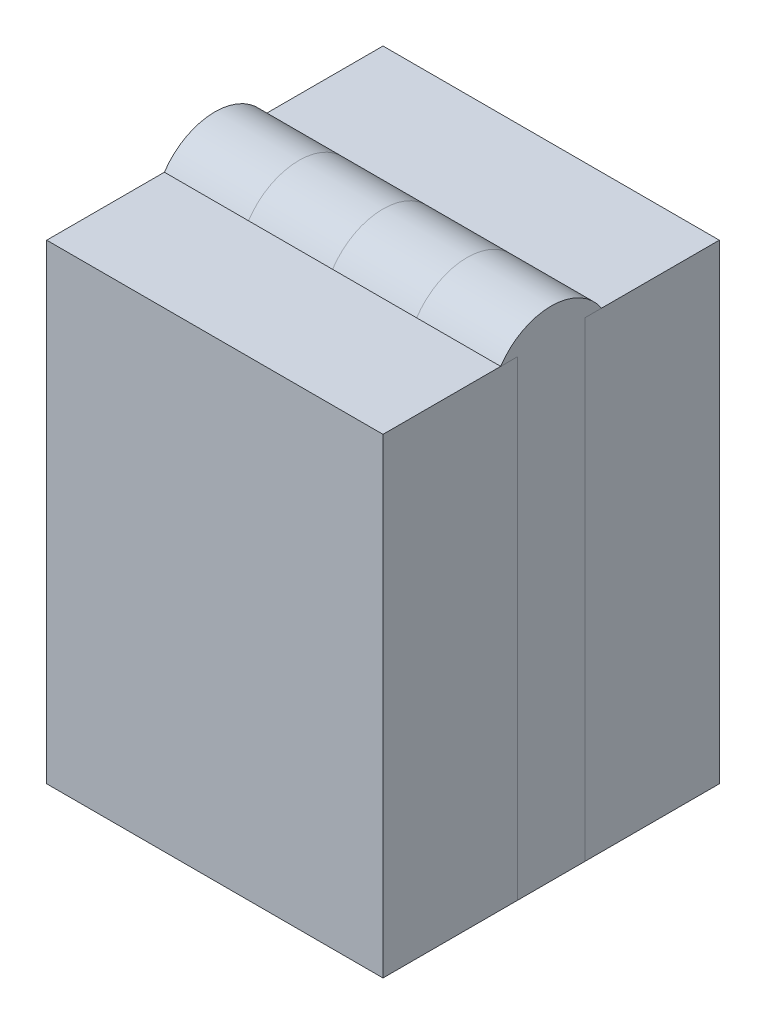
ISO-10303-21;
HEADER;
FILE_DESCRIPTION(('STEP AP214'),'2;1');
FILE_NAME('part.step','',(''),(''),'','','');
FILE_SCHEMA(('AUTOMOTIVE_DESIGN { 1 0 10303 214 1 1 1 1 }'));
ENDSEC;
DATA;
#1=APPLICATION_CONTEXT('core data for automotive mechanical design processes');
#2=APPLICATION_PROTOCOL_DEFINITION('international standard','automotive_design',2000,#1);
#3=PRODUCT_CONTEXT('',#1,'mechanical');
#4=PRODUCT('Part','Part','',(#3));
#5=PRODUCT_RELATED_PRODUCT_CATEGORY('part','',(#4));
#6=PRODUCT_DEFINITION_FORMATION('','',#4);
#7=PRODUCT_DEFINITION_CONTEXT('part definition',#1,'design');
#8=PRODUCT_DEFINITION('design','',#6,#7);
#9=PRODUCT_DEFINITION_SHAPE('','',#8);
#10=(LENGTH_UNIT() NAMED_UNIT(*) SI_UNIT(.MILLI.,.METRE.));
#11=(NAMED_UNIT(*) PLANE_ANGLE_UNIT() SI_UNIT($,.RADIAN.));
#12=(NAMED_UNIT(*) SI_UNIT($,.STERADIAN.) SOLID_ANGLE_UNIT());
#13=UNCERTAINTY_MEASURE_WITH_UNIT(LENGTH_MEASURE(1.E-05),#10,'distance_accuracy_value','');
#14=(GEOMETRIC_REPRESENTATION_CONTEXT(3) GLOBAL_UNCERTAINTY_ASSIGNED_CONTEXT((#13)) GLOBAL_UNIT_ASSIGNED_CONTEXT((#10,
#11,#12)) REPRESENTATION_CONTEXT('',''));
#15=CARTESIAN_POINT('',(0.,0.,0.));
#16=DIRECTION('',(0.,0.,1.));
#17=DIRECTION('',(1.,0.,0.));
#18=AXIS2_PLACEMENT_3D('',#15,#16,#17);
#19=CARTESIAN_POINT('',(5.,3.00190738505071,0.));
#20=DIRECTION('',(-1.,0.,0.));
#21=DIRECTION('',(0.,0.,1.));
#22=AXIS2_PLACEMENT_3D('',#19,#20,#21);
#23=CYLINDRICAL_SURFACE('',#22,0.900331190766501);
#24=CARTESIAN_POINT('',(3.75,3.00190738505071,0.));
#25=DIRECTION('',(1.,0.,0.));
#26=DIRECTION('',(0.,0.,-1.));
#27=AXIS2_PLACEMENT_3D('',#24,#25,#26);
#28=CIRCLE('',#27,0.900331190766501);
#29=CARTESIAN_POINT('',(3.75,3.5,-0.75));
#30=VERTEX_POINT('',#29);
#31=CARTESIAN_POINT('',(3.75,3.5,0.750000000000001));
#32=VERTEX_POINT('',#31);
#33=EDGE_CURVE('E130',#30,#32,#28,.T.);
#34=ORIENTED_EDGE('',*,*,#33,.T.);
#35=DIRECTION('',(-1.,0.,0.));
#36=VECTOR('',#35,1.);
#37=CARTESIAN_POINT('',(5.,3.5,0.750000000000001));
#38=LINE('',#37,#36);
#39=CARTESIAN_POINT('',(5.,3.5,0.750000000000001));
#40=VERTEX_POINT('',#39);
#41=EDGE_CURVE('E12',#40,#32,#38,.T.);
#42=ORIENTED_EDGE('',*,*,#41,.F.);
#43=CARTESIAN_POINT('',(5.,3.00190738505071,0.));
#44=DIRECTION('',(1.,0.,0.));
#45=DIRECTION('',(0.,0.,-1.));
#46=AXIS2_PLACEMENT_3D('',#43,#44,#45);
#47=CIRCLE('',#46,0.900331190766501);
#48=CARTESIAN_POINT('',(5.,3.5,-0.75));
#49=VERTEX_POINT('',#48);
#50=EDGE_CURVE('E140',#49,#40,#47,.T.);
#51=ORIENTED_EDGE('',*,*,#50,.F.);
#52=DIRECTION('',(-1.,0.,0.));
#53=VECTOR('',#52,1.);
#54=CARTESIAN_POINT('',(5.,3.5,-0.75));
#55=LINE('',#54,#53);
#56=EDGE_CURVE('E126',#49,#30,#55,.T.);
#57=ORIENTED_EDGE('',*,*,#56,.T.);
#58=EDGE_LOOP('',(#34,#42,#51,#57));
#59=FACE_BOUND('',#58,.T.);
#60=ADVANCED_FACE('F46',(#59),#23,.T.);
#61=CARTESIAN_POINT('',(5.,3.5,0.750000000000001));
#62=DIRECTION('',(0.,1.,0.));
#63=DIRECTION('',(0.,0.,1.));
#64=AXIS2_PLACEMENT_3D('',#61,#62,#63);
#65=PLANE('',#64);
#66=DIRECTION('',(0.,0.,-1.));
#67=VECTOR('',#66,1.);
#68=CARTESIAN_POINT('',(3.75,3.5,0.750000000000001));
#69=LINE('',#68,#67);
#70=CARTESIAN_POINT('',(3.75,3.5,0.499999999999987));
#71=VERTEX_POINT('',#70);
#72=EDGE_CURVE('E133',#32,#71,#69,.T.);
#73=ORIENTED_EDGE('',*,*,#72,.T.);
#74=DIRECTION('',(-1.,0.,0.));
#75=VECTOR('',#74,1.);
#76=CARTESIAN_POINT('',(5.,3.5,0.499999999999987));
#77=LINE('',#76,#75);
#78=CARTESIAN_POINT('',(5.,3.5,0.499999999999987));
#79=VERTEX_POINT('',#78);
#80=EDGE_CURVE('E54',#79,#71,#77,.T.);
#81=ORIENTED_EDGE('',*,*,#80,.F.);
#82=DIRECTION('',(0.,0.,-1.));
#83=VECTOR('',#82,1.);
#84=CARTESIAN_POINT('',(5.,3.5,0.750000000000001));
#85=LINE('',#84,#83);
#86=EDGE_CURVE('E99',#40,#79,#85,.T.);
#87=ORIENTED_EDGE('',*,*,#86,.F.);
#88=ORIENTED_EDGE('',*,*,#41,.T.);
#89=EDGE_LOOP('',(#73,#81,#87,#88));
#90=FACE_BOUND('',#89,.T.);
#91=ADVANCED_FACE('F164',(#90),#65,.F.);
#92=CARTESIAN_POINT('',(5.,3.5,0.499999999999987));
#93=DIRECTION('',(0.,0.,-1.));
#94=DIRECTION('',(-1.,0.,0.));
#95=AXIS2_PLACEMENT_3D('',#92,#93,#94);
#96=PLANE('',#95);
#97=DIRECTION('',(0.,-1.,0.));
#98=VECTOR('',#97,1.);
#99=CARTESIAN_POINT('',(3.75,3.5,0.499999999999987));
#100=LINE('',#99,#98);
#101=CARTESIAN_POINT('',(3.75,-3.5,0.499999999999987));
#102=VERTEX_POINT('',#101);
#103=EDGE_CURVE('E135',#71,#102,#100,.T.);
#104=ORIENTED_EDGE('',*,*,#103,.T.);
#105=DIRECTION('',(-1.,0.,0.));
#106=VECTOR('',#105,1.);
#107=CARTESIAN_POINT('',(5.,-3.5,0.499999999999987));
#108=LINE('',#107,#106);
#109=CARTESIAN_POINT('',(5.,-3.5,0.499999999999987));
#110=VERTEX_POINT('',#109);
#111=EDGE_CURVE('E121',#110,#102,#108,.T.);
#112=ORIENTED_EDGE('',*,*,#111,.F.);
#113=DIRECTION('',(0.,-1.,0.));
#114=VECTOR('',#113,1.);
#115=CARTESIAN_POINT('',(5.,3.5,0.499999999999987));
#116=LINE('',#115,#114);
#117=EDGE_CURVE('E112',#79,#110,#116,.T.);
#118=ORIENTED_EDGE('',*,*,#117,.F.);
#119=ORIENTED_EDGE('',*,*,#80,.T.);
#120=EDGE_LOOP('',(#104,#112,#118,#119));
#121=FACE_BOUND('',#120,.T.);
#122=ADVANCED_FACE('F146',(#121),#96,.F.);
#123=CARTESIAN_POINT('',(5.,-3.5,0.499999999999987));
#124=DIRECTION('',(0.,1.,0.));
#125=DIRECTION('',(0.,0.,1.));
#126=AXIS2_PLACEMENT_3D('',#123,#124,#125);
#127=PLANE('',#126);
#128=DIRECTION('',(0.,0.,-1.));
#129=VECTOR('',#128,1.);
#130=CARTESIAN_POINT('',(3.75,-3.5,0.499999999999987));
#131=LINE('',#130,#129);
#132=CARTESIAN_POINT('',(3.75,-3.5,-0.500000000000014));
#133=VERTEX_POINT('',#132);
#134=EDGE_CURVE('E120',#102,#133,#131,.T.);
#135=ORIENTED_EDGE('',*,*,#134,.T.);
#136=DIRECTION('',(-1.,0.,0.));
#137=VECTOR('',#136,1.);
#138=CARTESIAN_POINT('',(5.,-3.5,-0.500000000000014));
#139=LINE('',#138,#137);
#140=CARTESIAN_POINT('',(5.,-3.5,-0.500000000000014));
#141=VERTEX_POINT('',#140);
#142=EDGE_CURVE('E117',#141,#133,#139,.T.);
#143=ORIENTED_EDGE('',*,*,#142,.F.);
#144=DIRECTION('',(0.,0.,-1.));
#145=VECTOR('',#144,1.);
#146=CARTESIAN_POINT('',(5.,-3.5,0.499999999999987));
#147=LINE('',#146,#145);
#148=EDGE_CURVE('E106',#110,#141,#147,.T.);
#149=ORIENTED_EDGE('',*,*,#148,.F.);
#150=ORIENTED_EDGE('',*,*,#111,.T.);
#151=EDGE_LOOP('',(#135,#143,#149,#150));
#152=FACE_BOUND('',#151,.T.);
#153=ADVANCED_FACE('F118',(#152),#127,.F.);
#154=CARTESIAN_POINT('',(5.,-3.5,-0.500000000000014));
#155=DIRECTION('',(0.,0.,1.));
#156=DIRECTION('',(0.,-1.,0.));
#157=AXIS2_PLACEMENT_3D('',#154,#155,#156);
#158=PLANE('',#157);
#159=DIRECTION('',(0.,1.,0.));
#160=VECTOR('',#159,1.);
#161=CARTESIAN_POINT('',(3.75,-3.5,-0.500000000000014));
#162=LINE('',#161,#160);
#163=CARTESIAN_POINT('',(3.75,3.5,-0.500000000000013));
#164=VERTEX_POINT('',#163);
#165=EDGE_CURVE('E85',#133,#164,#162,.T.);
#166=ORIENTED_EDGE('',*,*,#165,.T.);
#167=DIRECTION('',(-1.,0.,0.));
#168=VECTOR('',#167,1.);
#169=CARTESIAN_POINT('',(5.,3.5,-0.500000000000013));
#170=LINE('',#169,#168);
#171=CARTESIAN_POINT('',(5.,3.5,-0.500000000000013));
#172=VERTEX_POINT('',#171);
#173=EDGE_CURVE('E122',#172,#164,#170,.T.);
#174=ORIENTED_EDGE('',*,*,#173,.F.);
#175=DIRECTION('',(0.,1.,0.));
#176=VECTOR('',#175,1.);
#177=CARTESIAN_POINT('',(5.,-3.5,-0.500000000000014));
#178=LINE('',#177,#176);
#179=EDGE_CURVE('E110',#141,#172,#178,.T.);
#180=ORIENTED_EDGE('',*,*,#179,.F.);
#181=ORIENTED_EDGE('',*,*,#142,.T.);
#182=EDGE_LOOP('',(#166,#174,#180,#181));
#183=FACE_BOUND('',#182,.T.);
#184=ADVANCED_FACE('F124',(#183),#158,.F.);
#185=CARTESIAN_POINT('',(5.,3.5,-0.500000000000013));
#186=DIRECTION('',(0.,1.,0.));
#187=DIRECTION('',(0.,0.,1.));
#188=AXIS2_PLACEMENT_3D('',#185,#186,#187);
#189=PLANE('',#188);
#190=DIRECTION('',(0.,0.,-1.));
#191=VECTOR('',#190,1.);
#192=CARTESIAN_POINT('',(3.75,3.5,-0.500000000000013));
#193=LINE('',#192,#191);
#194=EDGE_CURVE('E91',#164,#30,#193,.T.);
#195=ORIENTED_EDGE('',*,*,#194,.T.);
#196=ORIENTED_EDGE('',*,*,#56,.F.);
#197=DIRECTION('',(0.,0.,-1.));
#198=VECTOR('',#197,1.);
#199=CARTESIAN_POINT('',(5.,3.5,-0.500000000000013));
#200=LINE('',#199,#198);
#201=EDGE_CURVE('E62',#172,#49,#200,.T.);
#202=ORIENTED_EDGE('',*,*,#201,.F.);
#203=ORIENTED_EDGE('',*,*,#173,.T.);
#204=EDGE_LOOP('',(#195,#196,#202,#203));
#205=FACE_BOUND('',#204,.T.);
#206=ADVANCED_FACE('F153',(#205),#189,.F.);
#207=CARTESIAN_POINT('',(5.,3.00190738505071,0.));
#208=DIRECTION('',(1.,0.,0.));
#209=DIRECTION('',(0.,0.,-1.));
#210=AXIS2_PLACEMENT_3D('',#207,#208,#209);
#211=PLANE('',#210);
#212=ORIENTED_EDGE('',*,*,#50,.T.);
#213=ORIENTED_EDGE('',*,*,#86,.T.);
#214=ORIENTED_EDGE('',*,*,#117,.T.);
#215=ORIENTED_EDGE('',*,*,#148,.T.);
#216=ORIENTED_EDGE('',*,*,#179,.T.);
#217=ORIENTED_EDGE('',*,*,#201,.T.);
#218=EDGE_LOOP('',(#212,#213,#214,#215,#216,#217));
#219=FACE_BOUND('',#218,.T.);
#220=ADVANCED_FACE('F108',(#219),#211,.T.);
#221=CARTESIAN_POINT('',(3.75,3.00190738505071,0.));
#222=DIRECTION('',(1.,0.,0.));
#223=DIRECTION('',(0.,0.,-1.));
#224=AXIS2_PLACEMENT_3D('',#221,#222,#223);
#225=PLANE('',#224);
#226=ORIENTED_EDGE('',*,*,#33,.F.);
#227=ORIENTED_EDGE('',*,*,#194,.F.);
#228=ORIENTED_EDGE('',*,*,#165,.F.);
#229=ORIENTED_EDGE('',*,*,#134,.F.);
#230=ORIENTED_EDGE('',*,*,#103,.F.);
#231=ORIENTED_EDGE('',*,*,#72,.F.);
#232=EDGE_LOOP('',(#226,#227,#228,#229,#230,#231));
#233=FACE_BOUND('',#232,.T.);
#234=ADVANCED_FACE('F149',(#233),#225,.F.);
#235=CLOSED_SHELL('',(#60,#91,#122,#153,#184,#206,#220,#234));
#236=MANIFOLD_SOLID_BREP('B2',#235);
#237=CARTESIAN_POINT('',(3.75,3.00190738505071,0.));
#238=DIRECTION('',(-1.,0.,0.));
#239=DIRECTION('',(0.,0.,1.));
#240=AXIS2_PLACEMENT_3D('',#237,#238,#239);
#241=CYLINDRICAL_SURFACE('',#240,0.900331190766501);
#242=CARTESIAN_POINT('',(2.5,3.00190738505071,0.));
#243=DIRECTION('',(1.,0.,0.));
#244=DIRECTION('',(0.,0.,-1.));
#245=AXIS2_PLACEMENT_3D('',#242,#243,#244);
#246=CIRCLE('',#245,0.900331190766501);
#247=CARTESIAN_POINT('',(2.5,3.5,-0.75));
#248=VERTEX_POINT('',#247);
#249=CARTESIAN_POINT('',(2.5,3.5,0.750000000000001));
#250=VERTEX_POINT('',#249);
#251=EDGE_CURVE('E316',#248,#250,#246,.T.);
#252=ORIENTED_EDGE('',*,*,#251,.T.);
#253=DIRECTION('',(-1.,0.,0.));
#254=VECTOR('',#253,1.);
#255=CARTESIAN_POINT('',(3.75,3.5,0.750000000000001));
#256=LINE('',#255,#254);
#257=CARTESIAN_POINT('',(3.75,3.5,0.750000000000001));
#258=VERTEX_POINT('',#257);
#259=EDGE_CURVE('E44',#258,#250,#256,.T.);
#260=ORIENTED_EDGE('',*,*,#259,.F.);
#261=CARTESIAN_POINT('',(3.75,3.00190738505071,0.));
#262=DIRECTION('',(1.,0.,0.));
#263=DIRECTION('',(0.,0.,-1.));
#264=AXIS2_PLACEMENT_3D('',#261,#262,#263);
#265=CIRCLE('',#264,0.900331190766501);
#266=CARTESIAN_POINT('',(3.75,3.5,-0.75));
#267=VERTEX_POINT('',#266);
#268=EDGE_CURVE('E326',#267,#258,#265,.T.);
#269=ORIENTED_EDGE('',*,*,#268,.F.);
#270=DIRECTION('',(-1.,0.,0.));
#271=VECTOR('',#270,1.);
#272=CARTESIAN_POINT('',(3.75,3.5,-0.75));
#273=LINE('',#272,#271);
#274=EDGE_CURVE('E312',#267,#248,#273,.T.);
#275=ORIENTED_EDGE('',*,*,#274,.T.);
#276=EDGE_LOOP('',(#252,#260,#269,#275));
#277=FACE_BOUND('',#276,.T.);
#278=ADVANCED_FACE('F232',(#277),#241,.T.);
#279=CARTESIAN_POINT('',(3.75,3.5,0.750000000000001));
#280=DIRECTION('',(0.,1.,0.));
#281=DIRECTION('',(0.,0.,1.));
#282=AXIS2_PLACEMENT_3D('',#279,#280,#281);
#283=PLANE('',#282);
#284=DIRECTION('',(0.,0.,-1.));
#285=VECTOR('',#284,1.);
#286=CARTESIAN_POINT('',(2.5,3.5,0.750000000000001));
#287=LINE('',#286,#285);
#288=CARTESIAN_POINT('',(2.5,3.5,0.499999999999987));
#289=VERTEX_POINT('',#288);
#290=EDGE_CURVE('E319',#250,#289,#287,.T.);
#291=ORIENTED_EDGE('',*,*,#290,.T.);
#292=DIRECTION('',(-1.,0.,0.));
#293=VECTOR('',#292,1.);
#294=CARTESIAN_POINT('',(3.75,3.5,0.499999999999987));
#295=LINE('',#294,#293);
#296=CARTESIAN_POINT('',(3.75,3.5,0.499999999999987));
#297=VERTEX_POINT('',#296);
#298=EDGE_CURVE('E240',#297,#289,#295,.T.);
#299=ORIENTED_EDGE('',*,*,#298,.F.);
#300=DIRECTION('',(0.,0.,-1.));
#301=VECTOR('',#300,1.);
#302=CARTESIAN_POINT('',(3.75,3.5,0.750000000000001));
#303=LINE('',#302,#301);
#304=EDGE_CURVE('E285',#258,#297,#303,.T.);
#305=ORIENTED_EDGE('',*,*,#304,.F.);
#306=ORIENTED_EDGE('',*,*,#259,.T.);
#307=EDGE_LOOP('',(#291,#299,#305,#306));
#308=FACE_BOUND('',#307,.T.);
#309=ADVANCED_FACE('F350',(#308),#283,.F.);
#310=CARTESIAN_POINT('',(3.75,3.5,0.499999999999987));
#311=DIRECTION('',(0.,0.,-1.));
#312=DIRECTION('',(-1.,0.,0.));
#313=AXIS2_PLACEMENT_3D('',#310,#311,#312);
#314=PLANE('',#313);
#315=DIRECTION('',(0.,-1.,0.));
#316=VECTOR('',#315,1.);
#317=CARTESIAN_POINT('',(2.5,3.5,0.499999999999987));
#318=LINE('',#317,#316);
#319=CARTESIAN_POINT('',(2.5,-3.5,0.499999999999987));
#320=VERTEX_POINT('',#319);
#321=EDGE_CURVE('E321',#289,#320,#318,.T.);
#322=ORIENTED_EDGE('',*,*,#321,.T.);
#323=DIRECTION('',(-1.,0.,0.));
#324=VECTOR('',#323,1.);
#325=CARTESIAN_POINT('',(3.75,-3.5,0.499999999999987));
#326=LINE('',#325,#324);
#327=CARTESIAN_POINT('',(3.75,-3.5,0.499999999999987));
#328=VERTEX_POINT('',#327);
#329=EDGE_CURVE('E307',#328,#320,#326,.T.);
#330=ORIENTED_EDGE('',*,*,#329,.F.);
#331=DIRECTION('',(0.,-1.,0.));
#332=VECTOR('',#331,1.);
#333=CARTESIAN_POINT('',(3.75,3.5,0.499999999999987));
#334=LINE('',#333,#332);
#335=EDGE_CURVE('E298',#297,#328,#334,.T.);
#336=ORIENTED_EDGE('',*,*,#335,.F.);
#337=ORIENTED_EDGE('',*,*,#298,.T.);
#338=EDGE_LOOP('',(#322,#330,#336,#337));
#339=FACE_BOUND('',#338,.T.);
#340=ADVANCED_FACE('F332',(#339),#314,.F.);
#341=CARTESIAN_POINT('',(3.75,-3.5,0.499999999999987));
#342=DIRECTION('',(0.,1.,0.));
#343=DIRECTION('',(0.,0.,1.));
#344=AXIS2_PLACEMENT_3D('',#341,#342,#343);
#345=PLANE('',#344);
#346=DIRECTION('',(0.,0.,-1.));
#347=VECTOR('',#346,1.);
#348=CARTESIAN_POINT('',(2.5,-3.5,0.499999999999987));
#349=LINE('',#348,#347);
#350=CARTESIAN_POINT('',(2.5,-3.5,-0.500000000000014));
#351=VERTEX_POINT('',#350);
#352=EDGE_CURVE('E306',#320,#351,#349,.T.);
#353=ORIENTED_EDGE('',*,*,#352,.T.);
#354=DIRECTION('',(-1.,0.,0.));
#355=VECTOR('',#354,1.);
#356=CARTESIAN_POINT('',(3.75,-3.5,-0.500000000000014));
#357=LINE('',#356,#355);
#358=CARTESIAN_POINT('',(3.75,-3.5,-0.500000000000014));
#359=VERTEX_POINT('',#358);
#360=EDGE_CURVE('E303',#359,#351,#357,.T.);
#361=ORIENTED_EDGE('',*,*,#360,.F.);
#362=DIRECTION('',(0.,0.,-1.));
#363=VECTOR('',#362,1.);
#364=CARTESIAN_POINT('',(3.75,-3.5,0.499999999999987));
#365=LINE('',#364,#363);
#366=EDGE_CURVE('E292',#328,#359,#365,.T.);
#367=ORIENTED_EDGE('',*,*,#366,.F.);
#368=ORIENTED_EDGE('',*,*,#329,.T.);
#369=EDGE_LOOP('',(#353,#361,#367,#368));
#370=FACE_BOUND('',#369,.T.);
#371=ADVANCED_FACE('F304',(#370),#345,.F.);
#372=CARTESIAN_POINT('',(3.75,-3.5,-0.500000000000014));
#373=DIRECTION('',(0.,0.,1.));
#374=DIRECTION('',(0.,-1.,0.));
#375=AXIS2_PLACEMENT_3D('',#372,#373,#374);
#376=PLANE('',#375);
#377=DIRECTION('',(0.,1.,0.));
#378=VECTOR('',#377,1.);
#379=CARTESIAN_POINT('',(2.5,-3.5,-0.500000000000014));
#380=LINE('',#379,#378);
#381=CARTESIAN_POINT('',(2.5,3.5,-0.500000000000013));
#382=VERTEX_POINT('',#381);
#383=EDGE_CURVE('E271',#351,#382,#380,.T.);
#384=ORIENTED_EDGE('',*,*,#383,.T.);
#385=DIRECTION('',(-1.,0.,0.));
#386=VECTOR('',#385,1.);
#387=CARTESIAN_POINT('',(3.75,3.5,-0.500000000000013));
#388=LINE('',#387,#386);
#389=CARTESIAN_POINT('',(3.75,3.5,-0.500000000000013));
#390=VERTEX_POINT('',#389);
#391=EDGE_CURVE('E308',#390,#382,#388,.T.);
#392=ORIENTED_EDGE('',*,*,#391,.F.);
#393=DIRECTION('',(0.,1.,0.));
#394=VECTOR('',#393,1.);
#395=CARTESIAN_POINT('',(3.75,-3.5,-0.500000000000014));
#396=LINE('',#395,#394);
#397=EDGE_CURVE('E296',#359,#390,#396,.T.);
#398=ORIENTED_EDGE('',*,*,#397,.F.);
#399=ORIENTED_EDGE('',*,*,#360,.T.);
#400=EDGE_LOOP('',(#384,#392,#398,#399));
#401=FACE_BOUND('',#400,.T.);
#402=ADVANCED_FACE('F310',(#401),#376,.F.);
#403=CARTESIAN_POINT('',(3.75,3.5,-0.500000000000013));
#404=DIRECTION('',(0.,1.,0.));
#405=DIRECTION('',(0.,0.,1.));
#406=AXIS2_PLACEMENT_3D('',#403,#404,#405);
#407=PLANE('',#406);
#408=DIRECTION('',(0.,0.,-1.));
#409=VECTOR('',#408,1.);
#410=CARTESIAN_POINT('',(2.5,3.5,-0.500000000000013));
#411=LINE('',#410,#409);
#412=EDGE_CURVE('E277',#382,#248,#411,.T.);
#413=ORIENTED_EDGE('',*,*,#412,.T.);
#414=ORIENTED_EDGE('',*,*,#274,.F.);
#415=DIRECTION('',(0.,0.,-1.));
#416=VECTOR('',#415,1.);
#417=CARTESIAN_POINT('',(3.75,3.5,-0.500000000000013));
#418=LINE('',#417,#416);
#419=EDGE_CURVE('E248',#390,#267,#418,.T.);
#420=ORIENTED_EDGE('',*,*,#419,.F.);
#421=ORIENTED_EDGE('',*,*,#391,.T.);
#422=EDGE_LOOP('',(#413,#414,#420,#421));
#423=FACE_BOUND('',#422,.T.);
#424=ADVANCED_FACE('F339',(#423),#407,.F.);
#425=CARTESIAN_POINT('',(3.75,3.00190738505071,0.));
#426=DIRECTION('',(1.,0.,0.));
#427=DIRECTION('',(0.,0.,-1.));
#428=AXIS2_PLACEMENT_3D('',#425,#426,#427);
#429=PLANE('',#428);
#430=ORIENTED_EDGE('',*,*,#268,.T.);
#431=ORIENTED_EDGE('',*,*,#304,.T.);
#432=ORIENTED_EDGE('',*,*,#335,.T.);
#433=ORIENTED_EDGE('',*,*,#366,.T.);
#434=ORIENTED_EDGE('',*,*,#397,.T.);
#435=ORIENTED_EDGE('',*,*,#419,.T.);
#436=EDGE_LOOP('',(#430,#431,#432,#433,#434,#435));
#437=FACE_BOUND('',#436,.T.);
#438=ADVANCED_FACE('F294',(#437),#429,.T.);
#439=CARTESIAN_POINT('',(2.5,3.00190738505071,0.));
#440=DIRECTION('',(1.,0.,0.));
#441=DIRECTION('',(0.,0.,-1.));
#442=AXIS2_PLACEMENT_3D('',#439,#440,#441);
#443=PLANE('',#442);
#444=ORIENTED_EDGE('',*,*,#251,.F.);
#445=ORIENTED_EDGE('',*,*,#412,.F.);
#446=ORIENTED_EDGE('',*,*,#383,.F.);
#447=ORIENTED_EDGE('',*,*,#352,.F.);
#448=ORIENTED_EDGE('',*,*,#321,.F.);
#449=ORIENTED_EDGE('',*,*,#290,.F.);
#450=EDGE_LOOP('',(#444,#445,#446,#447,#448,#449));
#451=FACE_BOUND('',#450,.T.);
#452=ADVANCED_FACE('F335',(#451),#443,.F.);
#453=CLOSED_SHELL('',(#278,#309,#340,#371,#402,#424,#438,#452));
#454=MANIFOLD_SOLID_BREP('B6',#453);
#455=CARTESIAN_POINT('',(2.5,3.00190738505071,0.));
#456=DIRECTION('',(-1.,0.,0.));
#457=DIRECTION('',(0.,0.,1.));
#458=AXIS2_PLACEMENT_3D('',#455,#456,#457);
#459=CYLINDRICAL_SURFACE('',#458,0.900331190766501);
#460=CARTESIAN_POINT('',(1.25,3.00190738505071,0.));
#461=DIRECTION('',(1.,0.,0.));
#462=DIRECTION('',(0.,0.,-1.));
#463=AXIS2_PLACEMENT_3D('',#460,#461,#462);
#464=CIRCLE('',#463,0.900331190766501);
#465=CARTESIAN_POINT('',(1.25,3.5,-0.75));
#466=VERTEX_POINT('',#465);
#467=CARTESIAN_POINT('',(1.25,3.5,0.750000000000001));
#468=VERTEX_POINT('',#467);
#469=EDGE_CURVE('E502',#466,#468,#464,.T.);
#470=ORIENTED_EDGE('',*,*,#469,.T.);
#471=DIRECTION('',(-1.,0.,0.));
#472=VECTOR('',#471,1.);
#473=CARTESIAN_POINT('',(2.5,3.5,0.750000000000001));
#474=LINE('',#473,#472);
#475=CARTESIAN_POINT('',(2.5,3.5,0.750000000000001));
#476=VERTEX_POINT('',#475);
#477=EDGE_CURVE('E230',#476,#468,#474,.T.);
#478=ORIENTED_EDGE('',*,*,#477,.F.);
#479=CARTESIAN_POINT('',(2.5,3.00190738505071,0.));
#480=DIRECTION('',(1.,0.,0.));
#481=DIRECTION('',(0.,0.,-1.));
#482=AXIS2_PLACEMENT_3D('',#479,#480,#481);
#483=CIRCLE('',#482,0.900331190766501);
#484=CARTESIAN_POINT('',(2.5,3.5,-0.75));
#485=VERTEX_POINT('',#484);
#486=EDGE_CURVE('E512',#485,#476,#483,.T.);
#487=ORIENTED_EDGE('',*,*,#486,.F.);
#488=DIRECTION('',(-1.,0.,0.));
#489=VECTOR('',#488,1.);
#490=CARTESIAN_POINT('',(2.5,3.5,-0.75));
#491=LINE('',#490,#489);
#492=EDGE_CURVE('E498',#485,#466,#491,.T.);
#493=ORIENTED_EDGE('',*,*,#492,.T.);
#494=EDGE_LOOP('',(#470,#478,#487,#493));
#495=FACE_BOUND('',#494,.T.);
#496=ADVANCED_FACE('F418',(#495),#459,.T.);
#497=CARTESIAN_POINT('',(2.5,3.5,0.750000000000001));
#498=DIRECTION('',(0.,1.,0.));
#499=DIRECTION('',(0.,0.,1.));
#500=AXIS2_PLACEMENT_3D('',#497,#498,#499);
#501=PLANE('',#500);
#502=DIRECTION('',(0.,0.,-1.));
#503=VECTOR('',#502,1.);
#504=CARTESIAN_POINT('',(1.25,3.5,0.750000000000001));
#505=LINE('',#504,#503);
#506=CARTESIAN_POINT('',(1.25,3.5,0.499999999999987));
#507=VERTEX_POINT('',#506);
#508=EDGE_CURVE('E505',#468,#507,#505,.T.);
#509=ORIENTED_EDGE('',*,*,#508,.T.);
#510=DIRECTION('',(-1.,0.,0.));
#511=VECTOR('',#510,1.);
#512=CARTESIAN_POINT('',(2.5,3.5,0.499999999999987));
#513=LINE('',#512,#511);
#514=CARTESIAN_POINT('',(2.5,3.5,0.499999999999987));
#515=VERTEX_POINT('',#514);
#516=EDGE_CURVE('E426',#515,#507,#513,.T.);
#517=ORIENTED_EDGE('',*,*,#516,.F.);
#518=DIRECTION('',(0.,0.,-1.));
#519=VECTOR('',#518,1.);
#520=CARTESIAN_POINT('',(2.5,3.5,0.750000000000001));
#521=LINE('',#520,#519);
#522=EDGE_CURVE('E471',#476,#515,#521,.T.);
#523=ORIENTED_EDGE('',*,*,#522,.F.);
#524=ORIENTED_EDGE('',*,*,#477,.T.);
#525=EDGE_LOOP('',(#509,#517,#523,#524));
#526=FACE_BOUND('',#525,.T.);
#527=ADVANCED_FACE('F536',(#526),#501,.F.);
#528=CARTESIAN_POINT('',(2.5,3.5,0.499999999999987));
#529=DIRECTION('',(0.,0.,-1.));
#530=DIRECTION('',(-1.,0.,0.));
#531=AXIS2_PLACEMENT_3D('',#528,#529,#530);
#532=PLANE('',#531);
#533=DIRECTION('',(0.,-1.,0.));
#534=VECTOR('',#533,1.);
#535=CARTESIAN_POINT('',(1.25,3.5,0.499999999999987));
#536=LINE('',#535,#534);
#537=CARTESIAN_POINT('',(1.25,-3.5,0.499999999999987));
#538=VERTEX_POINT('',#537);
#539=EDGE_CURVE('E507',#507,#538,#536,.T.);
#540=ORIENTED_EDGE('',*,*,#539,.T.);
#541=DIRECTION('',(-1.,0.,0.));
#542=VECTOR('',#541,1.);
#543=CARTESIAN_POINT('',(2.5,-3.5,0.499999999999987));
#544=LINE('',#543,#542);
#545=CARTESIAN_POINT('',(2.5,-3.5,0.499999999999987));
#546=VERTEX_POINT('',#545);
#547=EDGE_CURVE('E493',#546,#538,#544,.T.);
#548=ORIENTED_EDGE('',*,*,#547,.F.);
#549=DIRECTION('',(0.,-1.,0.));
#550=VECTOR('',#549,1.);
#551=CARTESIAN_POINT('',(2.5,3.5,0.499999999999987));
#552=LINE('',#551,#550);
#553=EDGE_CURVE('E484',#515,#546,#552,.T.);
#554=ORIENTED_EDGE('',*,*,#553,.F.);
#555=ORIENTED_EDGE('',*,*,#516,.T.);
#556=EDGE_LOOP('',(#540,#548,#554,#555));
#557=FACE_BOUND('',#556,.T.);
#558=ADVANCED_FACE('F518',(#557),#532,.F.);
#559=CARTESIAN_POINT('',(2.5,-3.5,0.499999999999987));
#560=DIRECTION('',(0.,1.,0.));
#561=DIRECTION('',(0.,0.,1.));
#562=AXIS2_PLACEMENT_3D('',#559,#560,#561);
#563=PLANE('',#562);
#564=DIRECTION('',(0.,0.,-1.));
#565=VECTOR('',#564,1.);
#566=CARTESIAN_POINT('',(1.25,-3.5,0.499999999999987));
#567=LINE('',#566,#565);
#568=CARTESIAN_POINT('',(1.25,-3.5,-0.500000000000014));
#569=VERTEX_POINT('',#568);
#570=EDGE_CURVE('E492',#538,#569,#567,.T.);
#571=ORIENTED_EDGE('',*,*,#570,.T.);
#572=DIRECTION('',(-1.,0.,0.));
#573=VECTOR('',#572,1.);
#574=CARTESIAN_POINT('',(2.5,-3.5,-0.500000000000014));
#575=LINE('',#574,#573);
#576=CARTESIAN_POINT('',(2.5,-3.5,-0.500000000000014));
#577=VERTEX_POINT('',#576);
#578=EDGE_CURVE('E489',#577,#569,#575,.T.);
#579=ORIENTED_EDGE('',*,*,#578,.F.);
#580=DIRECTION('',(0.,0.,-1.));
#581=VECTOR('',#580,1.);
#582=CARTESIAN_POINT('',(2.5,-3.5,0.499999999999987));
#583=LINE('',#582,#581);
#584=EDGE_CURVE('E478',#546,#577,#583,.T.);
#585=ORIENTED_EDGE('',*,*,#584,.F.);
#586=ORIENTED_EDGE('',*,*,#547,.T.);
#587=EDGE_LOOP('',(#571,#579,#585,#586));
#588=FACE_BOUND('',#587,.T.);
#589=ADVANCED_FACE('F490',(#588),#563,.F.);
#590=CARTESIAN_POINT('',(2.5,-3.5,-0.500000000000014));
#591=DIRECTION('',(0.,0.,1.));
#592=DIRECTION('',(0.,-1.,0.));
#593=AXIS2_PLACEMENT_3D('',#590,#591,#592);
#594=PLANE('',#593);
#595=DIRECTION('',(0.,1.,0.));
#596=VECTOR('',#595,1.);
#597=CARTESIAN_POINT('',(1.25,-3.5,-0.500000000000014));
#598=LINE('',#597,#596);
#599=CARTESIAN_POINT('',(1.25,3.5,-0.500000000000013));
#600=VERTEX_POINT('',#599);
#601=EDGE_CURVE('E457',#569,#600,#598,.T.);
#602=ORIENTED_EDGE('',*,*,#601,.T.);
#603=DIRECTION('',(-1.,0.,0.));
#604=VECTOR('',#603,1.);
#605=CARTESIAN_POINT('',(2.5,3.5,-0.500000000000013));
#606=LINE('',#605,#604);
#607=CARTESIAN_POINT('',(2.5,3.5,-0.500000000000013));
#608=VERTEX_POINT('',#607);
#609=EDGE_CURVE('E494',#608,#600,#606,.T.);
#610=ORIENTED_EDGE('',*,*,#609,.F.);
#611=DIRECTION('',(0.,1.,0.));
#612=VECTOR('',#611,1.);
#613=CARTESIAN_POINT('',(2.5,-3.5,-0.500000000000014));
#614=LINE('',#613,#612);
#615=EDGE_CURVE('E482',#577,#608,#614,.T.);
#616=ORIENTED_EDGE('',*,*,#615,.F.);
#617=ORIENTED_EDGE('',*,*,#578,.T.);
#618=EDGE_LOOP('',(#602,#610,#616,#617));
#619=FACE_BOUND('',#618,.T.);
#620=ADVANCED_FACE('F496',(#619),#594,.F.);
#621=CARTESIAN_POINT('',(2.5,3.5,-0.500000000000013));
#622=DIRECTION('',(0.,1.,0.));
#623=DIRECTION('',(0.,0.,1.));
#624=AXIS2_PLACEMENT_3D('',#621,#622,#623);
#625=PLANE('',#624);
#626=DIRECTION('',(0.,0.,-1.));
#627=VECTOR('',#626,1.);
#628=CARTESIAN_POINT('',(1.25,3.5,-0.500000000000013));
#629=LINE('',#628,#627);
#630=EDGE_CURVE('E463',#600,#466,#629,.T.);
#631=ORIENTED_EDGE('',*,*,#630,.T.);
#632=ORIENTED_EDGE('',*,*,#492,.F.);
#633=DIRECTION('',(0.,0.,-1.));
#634=VECTOR('',#633,1.);
#635=CARTESIAN_POINT('',(2.5,3.5,-0.500000000000013));
#636=LINE('',#635,#634);
#637=EDGE_CURVE('E434',#608,#485,#636,.T.);
#638=ORIENTED_EDGE('',*,*,#637,.F.);
#639=ORIENTED_EDGE('',*,*,#609,.T.);
#640=EDGE_LOOP('',(#631,#632,#638,#639));
#641=FACE_BOUND('',#640,.T.);
#642=ADVANCED_FACE('F525',(#641),#625,.F.);
#643=CARTESIAN_POINT('',(2.5,3.00190738505071,0.));
#644=DIRECTION('',(1.,0.,0.));
#645=DIRECTION('',(0.,0.,-1.));
#646=AXIS2_PLACEMENT_3D('',#643,#644,#645);
#647=PLANE('',#646);
#648=ORIENTED_EDGE('',*,*,#486,.T.);
#649=ORIENTED_EDGE('',*,*,#522,.T.);
#650=ORIENTED_EDGE('',*,*,#553,.T.);
#651=ORIENTED_EDGE('',*,*,#584,.T.);
#652=ORIENTED_EDGE('',*,*,#615,.T.);
#653=ORIENTED_EDGE('',*,*,#637,.T.);
#654=EDGE_LOOP('',(#648,#649,#650,#651,#652,#653));
#655=FACE_BOUND('',#654,.T.);
#656=ADVANCED_FACE('F480',(#655),#647,.T.);
#657=CARTESIAN_POINT('',(1.25,3.00190738505071,0.));
#658=DIRECTION('',(1.,0.,0.));
#659=DIRECTION('',(0.,0.,-1.));
#660=AXIS2_PLACEMENT_3D('',#657,#658,#659);
#661=PLANE('',#660);
#662=ORIENTED_EDGE('',*,*,#469,.F.);
#663=ORIENTED_EDGE('',*,*,#630,.F.);
#664=ORIENTED_EDGE('',*,*,#601,.F.);
#665=ORIENTED_EDGE('',*,*,#570,.F.);
#666=ORIENTED_EDGE('',*,*,#539,.F.);
#667=ORIENTED_EDGE('',*,*,#508,.F.);
#668=EDGE_LOOP('',(#662,#663,#664,#665,#666,#667));
#669=FACE_BOUND('',#668,.T.);
#670=ADVANCED_FACE('F521',(#669),#661,.F.);
#671=CLOSED_SHELL('',(#496,#527,#558,#589,#620,#642,#656,#670));
#672=MANIFOLD_SOLID_BREP('B38',#671);
#673=CARTESIAN_POINT('',(1.25,3.5,0.));
#674=DIRECTION('',(0.,1.,0.));
#675=DIRECTION('',(0.,0.,1.));
#676=AXIS2_PLACEMENT_3D('',#673,#674,#675);
#677=PLANE('',#676);
#678=DIRECTION('',(0.,0.,-1.));
#679=VECTOR('',#678,1.);
#680=CARTESIAN_POINT('',(0.,3.5,0.));
#681=LINE('',#680,#679);
#682=CARTESIAN_POINT('',(0.,3.5,0.750000000000001));
#683=VERTEX_POINT('',#682);
#684=CARTESIAN_POINT('',(0.,3.5,0.499999999999987));
#685=VERTEX_POINT('',#684);
#686=EDGE_CURVE('E688',#683,#685,#681,.T.);
#687=ORIENTED_EDGE('',*,*,#686,.T.);
#688=DIRECTION('',(-1.,0.,0.));
#689=VECTOR('',#688,1.);
#690=CARTESIAN_POINT('',(1.25,3.5,0.499999999999987));
#691=LINE('',#690,#689);
#692=CARTESIAN_POINT('',(1.25,3.5,0.499999999999987));
#693=VERTEX_POINT('',#692);
#694=EDGE_CURVE('E416',#693,#685,#691,.T.);
#695=ORIENTED_EDGE('',*,*,#694,.F.);
#696=DIRECTION('',(0.,0.,-1.));
#697=VECTOR('',#696,1.);
#698=CARTESIAN_POINT('',(1.25,3.5,0.));
#699=LINE('',#698,#697);
#700=CARTESIAN_POINT('',(1.25,3.5,0.750000000000001));
#701=VERTEX_POINT('',#700);
#702=EDGE_CURVE('E622',#701,#693,#699,.T.);
#703=ORIENTED_EDGE('',*,*,#702,.F.);
#704=DIRECTION('',(-1.,0.,0.));
#705=VECTOR('',#704,1.);
#706=CARTESIAN_POINT('',(1.25,3.5,0.750000000000001));
#707=LINE('',#706,#705);
#708=EDGE_CURVE('E607',#701,#683,#707,.T.);
#709=ORIENTED_EDGE('',*,*,#708,.T.);
#710=EDGE_LOOP('',(#687,#695,#703,#709));
#711=FACE_BOUND('',#710,.T.);
#712=ADVANCED_FACE('F604',(#711),#677,.F.);
#713=CARTESIAN_POINT('',(1.25,0.,0.499999999999987));
#714=DIRECTION('',(0.,0.,1.));
#715=DIRECTION('',(1.,0.,0.));
#716=AXIS2_PLACEMENT_3D('',#713,#714,#715);
#717=PLANE('',#716);
#718=DIRECTION('',(0.,1.,0.));
#719=VECTOR('',#718,1.);
#720=CARTESIAN_POINT('',(0.,0.,0.499999999999987));
#721=LINE('',#720,#719);
#722=CARTESIAN_POINT('',(0.,-3.5,0.499999999999987));
#723=VERTEX_POINT('',#722);
#724=EDGE_CURVE('E699',#723,#685,#721,.T.);
#725=ORIENTED_EDGE('',*,*,#724,.F.);
#726=DIRECTION('',(-1.,0.,0.));
#727=VECTOR('',#726,1.);
#728=CARTESIAN_POINT('',(1.25,-3.5,0.499999999999987));
#729=LINE('',#728,#727);
#730=CARTESIAN_POINT('',(1.25,-3.5,0.499999999999987));
#731=VERTEX_POINT('',#730);
#732=EDGE_CURVE('E613',#731,#723,#729,.T.);
#733=ORIENTED_EDGE('',*,*,#732,.F.);
#734=DIRECTION('',(0.,1.,0.));
#735=VECTOR('',#734,1.);
#736=CARTESIAN_POINT('',(1.25,0.,0.499999999999987));
#737=LINE('',#736,#735);
#738=EDGE_CURVE('E668',#731,#693,#737,.T.);
#739=ORIENTED_EDGE('',*,*,#738,.T.);
#740=ORIENTED_EDGE('',*,*,#694,.T.);
#741=EDGE_LOOP('',(#725,#733,#739,#740));
#742=FACE_BOUND('',#741,.T.);
#743=ADVANCED_FACE('F721',(#742),#717,.T.);
#744=CARTESIAN_POINT('',(1.25,-3.5,0.));
#745=DIRECTION('',(0.,1.,0.));
#746=DIRECTION('',(0.,0.,1.));
#747=AXIS2_PLACEMENT_3D('',#744,#745,#746);
#748=PLANE('',#747);
#749=DIRECTION('',(0.,0.,-1.));
#750=VECTOR('',#749,1.);
#751=CARTESIAN_POINT('',(0.,-3.5,0.));
#752=LINE('',#751,#750);
#753=CARTESIAN_POINT('',(0.,-3.5,-0.500000000000014));
#754=VERTEX_POINT('',#753);
#755=EDGE_CURVE('E673',#723,#754,#752,.T.);
#756=ORIENTED_EDGE('',*,*,#755,.T.);
#757=DIRECTION('',(-1.,0.,0.));
#758=VECTOR('',#757,1.);
#759=CARTESIAN_POINT('',(1.25,-3.5,-0.500000000000014));
#760=LINE('',#759,#758);
#761=CARTESIAN_POINT('',(1.25,-3.5,-0.500000000000014));
#762=VERTEX_POINT('',#761);
#763=EDGE_CURVE('E671',#762,#754,#760,.T.);
#764=ORIENTED_EDGE('',*,*,#763,.F.);
#765=DIRECTION('',(0.,0.,-1.));
#766=VECTOR('',#765,1.);
#767=CARTESIAN_POINT('',(1.25,-3.5,0.));
#768=LINE('',#767,#766);
#769=EDGE_CURVE('E662',#731,#762,#768,.T.);
#770=ORIENTED_EDGE('',*,*,#769,.F.);
#771=ORIENTED_EDGE('',*,*,#732,.T.);
#772=EDGE_LOOP('',(#756,#764,#770,#771));
#773=FACE_BOUND('',#772,.T.);
#774=ADVANCED_FACE('F672',(#773),#748,.F.);
#775=CARTESIAN_POINT('',(1.25,0.,-0.500000000000013));
#776=DIRECTION('',(0.,0.,1.));
#777=DIRECTION('',(0.,-1.,0.));
#778=AXIS2_PLACEMENT_3D('',#775,#776,#777);
#779=PLANE('',#778);
#780=DIRECTION('',(0.,1.,0.));
#781=VECTOR('',#780,1.);
#782=CARTESIAN_POINT('',(0.,0.,-0.500000000000013));
#783=LINE('',#782,#781);
#784=CARTESIAN_POINT('',(0.,3.5,-0.500000000000013));
#785=VERTEX_POINT('',#784);
#786=EDGE_CURVE('E696',#754,#785,#783,.T.);
#787=ORIENTED_EDGE('',*,*,#786,.T.);
#788=DIRECTION('',(-1.,0.,0.));
#789=VECTOR('',#788,1.);
#790=CARTESIAN_POINT('',(1.25,3.5,-0.500000000000013));
#791=LINE('',#790,#789);
#792=CARTESIAN_POINT('',(1.25,3.5,-0.500000000000013));
#793=VERTEX_POINT('',#792);
#794=EDGE_CURVE('E676',#793,#785,#791,.T.);
#795=ORIENTED_EDGE('',*,*,#794,.F.);
#796=DIRECTION('',(0.,1.,0.));
#797=VECTOR('',#796,1.);
#798=CARTESIAN_POINT('',(1.25,0.,-0.500000000000013));
#799=LINE('',#798,#797);
#800=EDGE_CURVE('E666',#762,#793,#799,.T.);
#801=ORIENTED_EDGE('',*,*,#800,.F.);
#802=ORIENTED_EDGE('',*,*,#763,.T.);
#803=EDGE_LOOP('',(#787,#795,#801,#802));
#804=FACE_BOUND('',#803,.T.);
#805=ADVANCED_FACE('F678',(#804),#779,.F.);
#806=CARTESIAN_POINT('',(1.25,3.5,0.));
#807=DIRECTION('',(0.,1.,0.));
#808=DIRECTION('',(0.,0.,1.));
#809=AXIS2_PLACEMENT_3D('',#806,#807,#808);
#810=PLANE('',#809);
#811=DIRECTION('',(0.,0.,-1.));
#812=VECTOR('',#811,1.);
#813=CARTESIAN_POINT('',(0.,3.5,0.));
#814=LINE('',#813,#812);
#815=CARTESIAN_POINT('',(0.,3.5,-0.75));
#816=VERTEX_POINT('',#815);
#817=EDGE_CURVE('E693',#785,#816,#814,.T.);
#818=ORIENTED_EDGE('',*,*,#817,.T.);
#819=DIRECTION('',(-1.,0.,0.));
#820=VECTOR('',#819,1.);
#821=CARTESIAN_POINT('',(1.25,3.5,-0.75));
#822=LINE('',#821,#820);
#823=CARTESIAN_POINT('',(1.25,3.5,-0.75));
#824=VERTEX_POINT('',#823);
#825=EDGE_CURVE('E703',#824,#816,#822,.T.);
#826=ORIENTED_EDGE('',*,*,#825,.F.);
#827=DIRECTION('',(0.,0.,-1.));
#828=VECTOR('',#827,1.);
#829=CARTESIAN_POINT('',(1.25,3.5,0.));
#830=LINE('',#829,#828);
#831=EDGE_CURVE('E681',#793,#824,#830,.T.);
#832=ORIENTED_EDGE('',*,*,#831,.F.);
#833=ORIENTED_EDGE('',*,*,#794,.T.);
#834=EDGE_LOOP('',(#818,#826,#832,#833));
#835=FACE_BOUND('',#834,.T.);
#836=ADVANCED_FACE('F712',(#835),#810,.F.);
#837=CARTESIAN_POINT('',(1.25,3.00190738505071,0.));
#838=DIRECTION('',(-1.,0.,0.));
#839=DIRECTION('',(0.,0.,1.));
#840=AXIS2_PLACEMENT_3D('',#837,#838,#839);
#841=CYLINDRICAL_SURFACE('',#840,0.900331190766501);
#842=CARTESIAN_POINT('',(0.,3.00190738505071,0.));
#843=DIRECTION('',(-1.,0.,0.));
#844=DIRECTION('',(0.,0.,1.));
#845=AXIS2_PLACEMENT_3D('',#842,#843,#844);
#846=CIRCLE('',#845,0.900331190766501);
#847=EDGE_CURVE('E690',#683,#816,#846,.T.);
#848=ORIENTED_EDGE('',*,*,#847,.F.);
#849=ORIENTED_EDGE('',*,*,#708,.F.);
#850=CARTESIAN_POINT('',(1.25,3.00190738505071,0.));
#851=DIRECTION('',(-1.,0.,0.));
#852=DIRECTION('',(0.,0.,1.));
#853=AXIS2_PLACEMENT_3D('',#850,#851,#852);
#854=CIRCLE('',#853,0.900331190766501);
#855=EDGE_CURVE('E683',#701,#824,#854,.T.);
#856=ORIENTED_EDGE('',*,*,#855,.T.);
#857=ORIENTED_EDGE('',*,*,#825,.T.);
#858=EDGE_LOOP('',(#848,#849,#856,#857));
#859=FACE_BOUND('',#858,.T.);
#860=ADVANCED_FACE('F710',(#859),#841,.T.);
#861=CARTESIAN_POINT('',(1.25,0.,0.));
#862=DIRECTION('',(-1.,0.,0.));
#863=DIRECTION('',(0.,0.,1.));
#864=AXIS2_PLACEMENT_3D('',#861,#862,#863);
#865=PLANE('',#864);
#866=ORIENTED_EDGE('',*,*,#702,.T.);
#867=ORIENTED_EDGE('',*,*,#738,.F.);
#868=ORIENTED_EDGE('',*,*,#769,.T.);
#869=ORIENTED_EDGE('',*,*,#800,.T.);
#870=ORIENTED_EDGE('',*,*,#831,.T.);
#871=ORIENTED_EDGE('',*,*,#855,.F.);
#872=EDGE_LOOP('',(#866,#867,#868,#869,#870,#871));
#873=FACE_BOUND('',#872,.T.);
#874=ADVANCED_FACE('F664',(#873),#865,.F.);
#875=CARTESIAN_POINT('',(0.,0.,0.));
#876=DIRECTION('',(-1.,0.,0.));
#877=DIRECTION('',(0.,0.,1.));
#878=AXIS2_PLACEMENT_3D('',#875,#876,#877);
#879=PLANE('',#878);
#880=ORIENTED_EDGE('',*,*,#686,.F.);
#881=ORIENTED_EDGE('',*,*,#847,.T.);
#882=ORIENTED_EDGE('',*,*,#817,.F.);
#883=ORIENTED_EDGE('',*,*,#786,.F.);
#884=ORIENTED_EDGE('',*,*,#755,.F.);
#885=ORIENTED_EDGE('',*,*,#724,.T.);
#886=EDGE_LOOP('',(#880,#881,#882,#883,#884,#885));
#887=FACE_BOUND('',#886,.T.);
#888=ADVANCED_FACE('F708',(#887),#879,.T.);
#889=CLOSED_SHELL('',(#712,#743,#774,#805,#836,#860,#874,#888));
#890=MANIFOLD_SOLID_BREP('B224',#889);
#891=CARTESIAN_POINT('',(5.,0.,-0.500000000000013));
#892=DIRECTION('',(0.,0.,-1.));
#893=DIRECTION('',(0.,1.,0.));
#894=AXIS2_PLACEMENT_3D('',#891,#892,#893);
#895=PLANE('',#894);
#896=DIRECTION('',(0.,-1.,0.));
#897=VECTOR('',#896,1.);
#898=CARTESIAN_POINT('',(0.,0.,-0.500000000000013));
#899=LINE('',#898,#897);
#900=CARTESIAN_POINT('',(0.,3.5,-0.500000000000013));
#901=VERTEX_POINT('',#900);
#902=CARTESIAN_POINT('',(0.,-3.5,-0.500000000000014));
#903=VERTEX_POINT('',#902);
#904=EDGE_CURVE('E858',#901,#903,#899,.T.);
#905=ORIENTED_EDGE('',*,*,#904,.T.);
#906=DIRECTION('',(-1.,0.,0.));
#907=VECTOR('',#906,1.);
#908=CARTESIAN_POINT('',(5.,-3.5,-0.500000000000014));
#909=LINE('',#908,#907);
#910=CARTESIAN_POINT('',(5.,-3.5,-0.500000000000014));
#911=VERTEX_POINT('',#910);
#912=EDGE_CURVE('E602',#911,#903,#909,.T.);
#913=ORIENTED_EDGE('',*,*,#912,.F.);
#914=DIRECTION('',(0.,-1.,0.));
#915=VECTOR('',#914,1.);
#916=CARTESIAN_POINT('',(5.,0.,-0.500000000000013));
#917=LINE('',#916,#915);
#918=CARTESIAN_POINT('',(5.,3.5,-0.500000000000013));
#919=VERTEX_POINT('',#918);
#920=EDGE_CURVE('E844',#919,#911,#917,.T.);
#921=ORIENTED_EDGE('',*,*,#920,.F.);
#922=DIRECTION('',(-1.,0.,0.));
#923=VECTOR('',#922,1.);
#924=CARTESIAN_POINT('',(5.,3.5,-0.500000000000013));
#925=LINE('',#924,#923);
#926=EDGE_CURVE('E811',#919,#901,#925,.T.);
#927=ORIENTED_EDGE('',*,*,#926,.T.);
#928=EDGE_LOOP('',(#905,#913,#921,#927));
#929=FACE_BOUND('',#928,.T.);
#930=ADVANCED_FACE('F795',(#929),#895,.F.);
#931=CARTESIAN_POINT('',(5.,-3.5,0.));
#932=DIRECTION('',(0.,1.,0.));
#933=DIRECTION('',(0.,0.,1.));
#934=AXIS2_PLACEMENT_3D('',#931,#932,#933);
#935=PLANE('',#934);
#936=DIRECTION('',(0.,0.,-1.));
#937=VECTOR('',#936,1.);
#938=CARTESIAN_POINT('',(0.,-3.5,0.));
#939=LINE('',#938,#937);
#940=CARTESIAN_POINT('',(0.,-3.5,-2.50000000000002));
#941=VERTEX_POINT('',#940);
#942=EDGE_CURVE('E849',#903,#941,#939,.T.);
#943=ORIENTED_EDGE('',*,*,#942,.T.);
#944=DIRECTION('',(-1.,0.,0.));
#945=VECTOR('',#944,1.);
#946=CARTESIAN_POINT('',(5.,-3.5,-2.50000000000002));
#947=LINE('',#946,#945);
#948=CARTESIAN_POINT('',(5.,-3.5,-2.50000000000002));
#949=VERTEX_POINT('',#948);
#950=EDGE_CURVE('E803',#949,#941,#947,.T.);
#951=ORIENTED_EDGE('',*,*,#950,.F.);
#952=DIRECTION('',(0.,0.,-1.));
#953=VECTOR('',#952,1.);
#954=CARTESIAN_POINT('',(5.,-3.5,0.));
#955=LINE('',#954,#953);
#956=EDGE_CURVE('E837',#911,#949,#955,.T.);
#957=ORIENTED_EDGE('',*,*,#956,.F.);
#958=ORIENTED_EDGE('',*,*,#912,.T.);
#959=EDGE_LOOP('',(#943,#951,#957,#958));
#960=FACE_BOUND('',#959,.T.);
#961=ADVANCED_FACE('F848',(#960),#935,.F.);
#962=CARTESIAN_POINT('',(5.,0.,-2.50000000000002));
#963=DIRECTION('',(0.,0.,1.));
#964=DIRECTION('',(1.,0.,0.));
#965=AXIS2_PLACEMENT_3D('',#962,#963,#964);
#966=PLANE('',#965);
#967=DIRECTION('',(0.,1.,0.));
#968=VECTOR('',#967,1.);
#969=CARTESIAN_POINT('',(0.,0.,-2.50000000000002));
#970=LINE('',#969,#968);
#971=CARTESIAN_POINT('',(0.,3.5,-2.50000000000002));
#972=VERTEX_POINT('',#971);
#973=EDGE_CURVE('E861',#941,#972,#970,.T.);
#974=ORIENTED_EDGE('',*,*,#973,.T.);
#975=DIRECTION('',(-1.,0.,0.));
#976=VECTOR('',#975,1.);
#977=CARTESIAN_POINT('',(5.,3.5,-2.50000000000002));
#978=LINE('',#977,#976);
#979=CARTESIAN_POINT('',(5.,3.5,-2.50000000000002));
#980=VERTEX_POINT('',#979);
#981=EDGE_CURVE('E826',#980,#972,#978,.T.);
#982=ORIENTED_EDGE('',*,*,#981,.F.);
#983=DIRECTION('',(0.,1.,0.));
#984=VECTOR('',#983,1.);
#985=CARTESIAN_POINT('',(5.,0.,-2.50000000000002));
#986=LINE('',#985,#984);
#987=EDGE_CURVE('E843',#949,#980,#986,.T.);
#988=ORIENTED_EDGE('',*,*,#987,.F.);
#989=ORIENTED_EDGE('',*,*,#950,.T.);
#990=EDGE_LOOP('',(#974,#982,#988,#989));
#991=FACE_BOUND('',#990,.T.);
#992=ADVANCED_FACE('F852',(#991),#966,.F.);
#993=CARTESIAN_POINT('',(5.,3.5,0.));
#994=DIRECTION('',(0.,1.,0.));
#995=DIRECTION('',(0.,0.,1.));
#996=AXIS2_PLACEMENT_3D('',#993,#994,#995);
#997=PLANE('',#996);
#998=DIRECTION('',(0.,0.,-1.));
#999=VECTOR('',#998,1.);
#1000=CARTESIAN_POINT('',(0.,3.5,0.));
#1001=LINE('',#1000,#999);
#1002=EDGE_CURVE('E863',#901,#972,#1001,.T.);
#1003=ORIENTED_EDGE('',*,*,#1002,.F.);
#1004=ORIENTED_EDGE('',*,*,#926,.F.);
#1005=DIRECTION('',(0.,0.,-1.));
#1006=VECTOR('',#1005,1.);
#1007=CARTESIAN_POINT('',(5.,3.5,0.));
#1008=LINE('',#1007,#1006);
#1009=EDGE_CURVE('E853',#919,#980,#1008,.T.);
#1010=ORIENTED_EDGE('',*,*,#1009,.T.);
#1011=ORIENTED_EDGE('',*,*,#981,.T.);
#1012=EDGE_LOOP('',(#1003,#1004,#1010,#1011));
#1013=FACE_BOUND('',#1012,.T.);
#1014=ADVANCED_FACE('F869',(#1013),#997,.T.);
#1015=CARTESIAN_POINT('',(5.,0.,0.));
#1016=DIRECTION('',(1.,0.,0.));
#1017=DIRECTION('',(0.,0.,-1.));
#1018=AXIS2_PLACEMENT_3D('',#1015,#1016,#1017);
#1019=PLANE('',#1018);
#1020=ORIENTED_EDGE('',*,*,#920,.T.);
#1021=ORIENTED_EDGE('',*,*,#956,.T.);
#1022=ORIENTED_EDGE('',*,*,#987,.T.);
#1023=ORIENTED_EDGE('',*,*,#1009,.F.);
#1024=EDGE_LOOP('',(#1020,#1021,#1022,#1023));
#1025=FACE_BOUND('',#1024,.T.);
#1026=ADVANCED_FACE('F840',(#1025),#1019,.T.);
#1027=CARTESIAN_POINT('',(0.,0.,0.));
#1028=DIRECTION('',(1.,0.,0.));
#1029=DIRECTION('',(0.,0.,-1.));
#1030=AXIS2_PLACEMENT_3D('',#1027,#1028,#1029);
#1031=PLANE('',#1030);
#1032=ORIENTED_EDGE('',*,*,#904,.F.);
#1033=ORIENTED_EDGE('',*,*,#1002,.T.);
#1034=ORIENTED_EDGE('',*,*,#973,.F.);
#1035=ORIENTED_EDGE('',*,*,#942,.F.);
#1036=EDGE_LOOP('',(#1032,#1033,#1034,#1035));
#1037=FACE_BOUND('',#1036,.T.);
#1038=ADVANCED_FACE('F868',(#1037),#1031,.F.);
#1039=CLOSED_SHELL('',(#930,#961,#992,#1014,#1026,#1038));
#1040=MANIFOLD_SOLID_BREP('B410',#1039);
#1041=CARTESIAN_POINT('',(5.,-3.5,0.));
#1042=DIRECTION('',(0.,1.,0.));
#1043=DIRECTION('',(0.,0.,1.));
#1044=AXIS2_PLACEMENT_3D('',#1041,#1042,#1043);
#1045=PLANE('',#1044);
#1046=DIRECTION('',(0.,0.,-1.));
#1047=VECTOR('',#1046,1.);
#1048=CARTESIAN_POINT('',(0.,-3.5,0.));
#1049=LINE('',#1048,#1047);
#1050=CARTESIAN_POINT('',(0.,-3.5,2.5));
#1051=VERTEX_POINT('',#1050);
#1052=CARTESIAN_POINT('',(0.,-3.5,0.499999999999987));
#1053=VERTEX_POINT('',#1052);
#1054=EDGE_CURVE('E982',#1051,#1053,#1049,.T.);
#1055=ORIENTED_EDGE('',*,*,#1054,.T.);
#1056=DIRECTION('',(-1.,0.,0.));
#1057=VECTOR('',#1056,1.);
#1058=CARTESIAN_POINT('',(5.,-3.5,0.499999999999987));
#1059=LINE('',#1058,#1057);
#1060=CARTESIAN_POINT('',(5.,-3.5,0.499999999999987));
#1061=VERTEX_POINT('',#1060);
#1062=EDGE_CURVE('E793',#1061,#1053,#1059,.T.);
#1063=ORIENTED_EDGE('',*,*,#1062,.F.);
#1064=DIRECTION('',(0.,0.,-1.));
#1065=VECTOR('',#1064,1.);
#1066=CARTESIAN_POINT('',(5.,-3.5,0.));
#1067=LINE('',#1066,#1065);
#1068=CARTESIAN_POINT('',(5.,-3.5,2.5));
#1069=VERTEX_POINT('',#1068);
#1070=EDGE_CURVE('E968',#1069,#1061,#1067,.T.);
#1071=ORIENTED_EDGE('',*,*,#1070,.F.);
#1072=DIRECTION('',(-1.,0.,0.));
#1073=VECTOR('',#1072,1.);
#1074=CARTESIAN_POINT('',(5.,-3.5,2.5));
#1075=LINE('',#1074,#1073);
#1076=EDGE_CURVE('E935',#1069,#1051,#1075,.T.);
#1077=ORIENTED_EDGE('',*,*,#1076,.T.);
#1078=EDGE_LOOP('',(#1055,#1063,#1071,#1077));
#1079=FACE_BOUND('',#1078,.T.);
#1080=ADVANCED_FACE('F919',(#1079),#1045,.F.);
#1081=CARTESIAN_POINT('',(5.,0.,0.499999999999987));
#1082=DIRECTION('',(0.,0.,1.));
#1083=DIRECTION('',(1.,0.,0.));
#1084=AXIS2_PLACEMENT_3D('',#1081,#1082,#1083);
#1085=PLANE('',#1084);
#1086=DIRECTION('',(0.,1.,0.));
#1087=VECTOR('',#1086,1.);
#1088=CARTESIAN_POINT('',(0.,0.,0.499999999999987));
#1089=LINE('',#1088,#1087);
#1090=CARTESIAN_POINT('',(0.,3.5,0.499999999999987));
#1091=VERTEX_POINT('',#1090);
#1092=EDGE_CURVE('E973',#1053,#1091,#1089,.T.);
#1093=ORIENTED_EDGE('',*,*,#1092,.T.);
#1094=DIRECTION('',(-1.,0.,0.));
#1095=VECTOR('',#1094,1.);
#1096=CARTESIAN_POINT('',(5.,3.5,0.499999999999987));
#1097=LINE('',#1096,#1095);
#1098=CARTESIAN_POINT('',(5.,3.5,0.499999999999987));
#1099=VERTEX_POINT('',#1098);
#1100=EDGE_CURVE('E927',#1099,#1091,#1097,.T.);
#1101=ORIENTED_EDGE('',*,*,#1100,.F.);
#1102=DIRECTION('',(0.,1.,0.));
#1103=VECTOR('',#1102,1.);
#1104=CARTESIAN_POINT('',(5.,0.,0.499999999999987));
#1105=LINE('',#1104,#1103);
#1106=EDGE_CURVE('E960',#1061,#1099,#1105,.T.);
#1107=ORIENTED_EDGE('',*,*,#1106,.F.);
#1108=ORIENTED_EDGE('',*,*,#1062,.T.);
#1109=EDGE_LOOP('',(#1093,#1101,#1107,#1108));
#1110=FACE_BOUND('',#1109,.T.);
#1111=ADVANCED_FACE('F972',(#1110),#1085,.F.);
#1112=CARTESIAN_POINT('',(5.,3.5,0.));
#1113=DIRECTION('',(0.,1.,0.));
#1114=DIRECTION('',(0.,0.,1.));
#1115=AXIS2_PLACEMENT_3D('',#1112,#1113,#1114);
#1116=PLANE('',#1115);
#1117=DIRECTION('',(0.,0.,-1.));
#1118=VECTOR('',#1117,1.);
#1119=CARTESIAN_POINT('',(0.,3.5,0.));
#1120=LINE('',#1119,#1118);
#1121=CARTESIAN_POINT('',(0.,3.5,2.49999999999999));
#1122=VERTEX_POINT('',#1121);
#1123=EDGE_CURVE('E985',#1122,#1091,#1120,.T.);
#1124=ORIENTED_EDGE('',*,*,#1123,.F.);
#1125=DIRECTION('',(-1.,0.,0.));
#1126=VECTOR('',#1125,1.);
#1127=CARTESIAN_POINT('',(5.,3.5,2.49999999999999));
#1128=LINE('',#1127,#1126);
#1129=CARTESIAN_POINT('',(5.,3.5,2.49999999999999));
#1130=VERTEX_POINT('',#1129);
#1131=EDGE_CURVE('E949',#1130,#1122,#1128,.T.);
#1132=ORIENTED_EDGE('',*,*,#1131,.F.);
#1133=DIRECTION('',(0.,0.,-1.));
#1134=VECTOR('',#1133,1.);
#1135=CARTESIAN_POINT('',(5.,3.5,0.));
#1136=LINE('',#1135,#1134);
#1137=EDGE_CURVE('E967',#1130,#1099,#1136,.T.);
#1138=ORIENTED_EDGE('',*,*,#1137,.T.);
#1139=ORIENTED_EDGE('',*,*,#1100,.T.);
#1140=EDGE_LOOP('',(#1124,#1132,#1138,#1139));
#1141=FACE_BOUND('',#1140,.T.);
#1142=ADVANCED_FACE('F976',(#1141),#1116,.T.);
#1143=CARTESIAN_POINT('',(5.,0.,2.49999999999999));
#1144=DIRECTION('',(0.,0.,1.));
#1145=DIRECTION('',(0.,-1.,0.));
#1146=AXIS2_PLACEMENT_3D('',#1143,#1144,#1145);
#1147=PLANE('',#1146);
#1148=DIRECTION('',(0.,1.,0.));
#1149=VECTOR('',#1148,1.);
#1150=CARTESIAN_POINT('',(0.,0.,2.49999999999999));
#1151=LINE('',#1150,#1149);
#1152=EDGE_CURVE('E987',#1051,#1122,#1151,.T.);
#1153=ORIENTED_EDGE('',*,*,#1152,.F.);
#1154=ORIENTED_EDGE('',*,*,#1076,.F.);
#1155=DIRECTION('',(0.,1.,0.));
#1156=VECTOR('',#1155,1.);
#1157=CARTESIAN_POINT('',(5.,0.,2.49999999999999));
#1158=LINE('',#1157,#1156);
#1159=EDGE_CURVE('E977',#1069,#1130,#1158,.T.);
#1160=ORIENTED_EDGE('',*,*,#1159,.T.);
#1161=ORIENTED_EDGE('',*,*,#1131,.T.);
#1162=EDGE_LOOP('',(#1153,#1154,#1160,#1161));
#1163=FACE_BOUND('',#1162,.T.);
#1164=ADVANCED_FACE('F993',(#1163),#1147,.T.);
#1165=CARTESIAN_POINT('',(5.,0.,0.));
#1166=DIRECTION('',(1.,0.,0.));
#1167=DIRECTION('',(0.,0.,-1.));
#1168=AXIS2_PLACEMENT_3D('',#1165,#1166,#1167);
#1169=PLANE('',#1168);
#1170=ORIENTED_EDGE('',*,*,#1070,.T.);
#1171=ORIENTED_EDGE('',*,*,#1106,.T.);
#1172=ORIENTED_EDGE('',*,*,#1137,.F.);
#1173=ORIENTED_EDGE('',*,*,#1159,.F.);
#1174=EDGE_LOOP('',(#1170,#1171,#1172,#1173));
#1175=FACE_BOUND('',#1174,.T.);
#1176=ADVANCED_FACE('F964',(#1175),#1169,.T.);
#1177=CARTESIAN_POINT('',(0.,0.,0.));
#1178=DIRECTION('',(1.,0.,0.));
#1179=DIRECTION('',(0.,0.,-1.));
#1180=AXIS2_PLACEMENT_3D('',#1177,#1178,#1179);
#1181=PLANE('',#1180);
#1182=ORIENTED_EDGE('',*,*,#1054,.F.);
#1183=ORIENTED_EDGE('',*,*,#1152,.T.);
#1184=ORIENTED_EDGE('',*,*,#1123,.T.);
#1185=ORIENTED_EDGE('',*,*,#1092,.F.);
#1186=EDGE_LOOP('',(#1182,#1183,#1184,#1185));
#1187=FACE_BOUND('',#1186,.T.);
#1188=ADVANCED_FACE('F992',(#1187),#1181,.F.);
#1189=CLOSED_SHELL('',(#1080,#1111,#1142,#1164,#1176,#1188));
#1190=MANIFOLD_SOLID_BREP('B596',#1189);
#1191=ADVANCED_BREP_SHAPE_REPRESENTATION('',(#18,#236,#454,#672,#890,#1040,#1190),#14);
#1192=SHAPE_DEFINITION_REPRESENTATION(#9,#1191);
ENDSEC;
END-ISO-10303-21;
